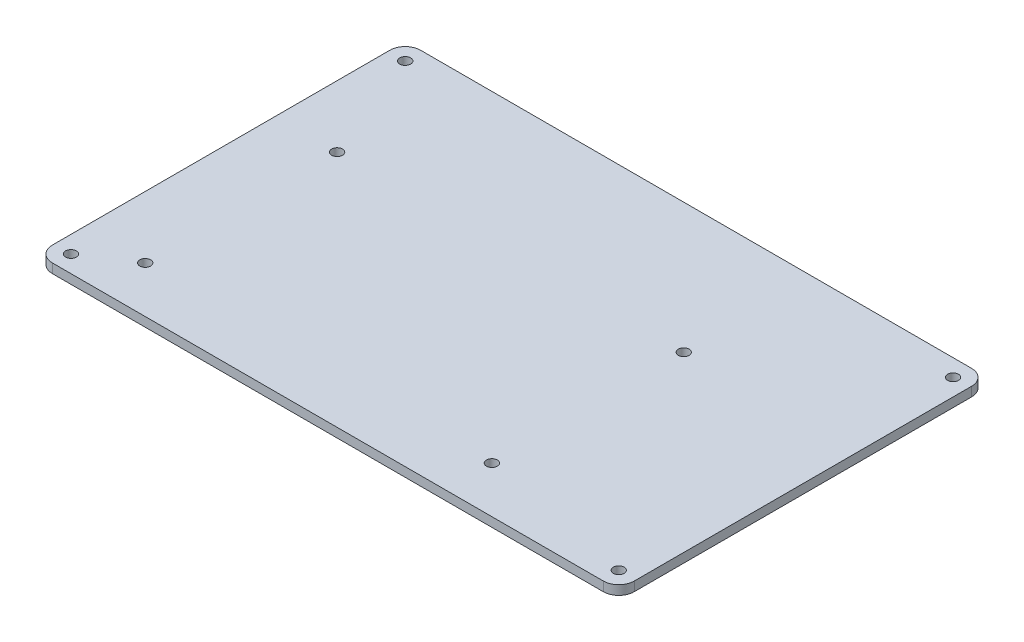
ISO-10303-21;
HEADER;
FILE_DESCRIPTION(('STEP AP214'),'2;1');
FILE_NAME('part.step','',(''),(''),'','','');
FILE_SCHEMA(('AUTOMOTIVE_DESIGN { 1 0 10303 214 1 1 1 1 }'));
ENDSEC;
DATA;
#1=APPLICATION_CONTEXT('core data for automotive mechanical design processes');
#2=APPLICATION_PROTOCOL_DEFINITION('international standard','automotive_design',2000,#1);
#3=PRODUCT_CONTEXT('',#1,'mechanical');
#4=PRODUCT('Part','Part','',(#3));
#5=PRODUCT_RELATED_PRODUCT_CATEGORY('part','',(#4));
#6=PRODUCT_DEFINITION_FORMATION('','',#4);
#7=PRODUCT_DEFINITION_CONTEXT('part definition',#1,'design');
#8=PRODUCT_DEFINITION('design','',#6,#7);
#9=PRODUCT_DEFINITION_SHAPE('','',#8);
#10=(LENGTH_UNIT() NAMED_UNIT(*) SI_UNIT(.MILLI.,.METRE.));
#11=(NAMED_UNIT(*) PLANE_ANGLE_UNIT() SI_UNIT($,.RADIAN.));
#12=(NAMED_UNIT(*) SI_UNIT($,.STERADIAN.) SOLID_ANGLE_UNIT());
#13=UNCERTAINTY_MEASURE_WITH_UNIT(LENGTH_MEASURE(1.E-05),#10,'distance_accuracy_value','');
#14=(GEOMETRIC_REPRESENTATION_CONTEXT(3) GLOBAL_UNCERTAINTY_ASSIGNED_CONTEXT((#13)) GLOBAL_UNIT_ASSIGNED_CONTEXT((#10,
#11,#12)) REPRESENTATION_CONTEXT('',''));
#15=CARTESIAN_POINT('',(0.,0.,0.));
#16=DIRECTION('',(0.,0.,1.));
#17=DIRECTION('',(1.,0.,0.));
#18=AXIS2_PLACEMENT_3D('',#15,#16,#17);
#19=CARTESIAN_POINT('',(-8.59109213570956,3.,30.3281794014014));
#20=DIRECTION('',(0.,-1.,0.));
#21=DIRECTION('',(0.,0.,-1.));
#22=AXIS2_PLACEMENT_3D('',#19,#20,#21);
#23=CYLINDRICAL_SURFACE('',#22,5.);
#24=CARTESIAN_POINT('',(-8.59109213570956,0.,30.3281794014014));
#25=DIRECTION('',(0.,1.,0.));
#26=DIRECTION('',(0.,0.,1.));
#27=AXIS2_PLACEMENT_3D('',#24,#25,#26);
#28=CIRCLE('',#27,5.);
#29=CARTESIAN_POINT('',(-8.59109213570956,0.,25.3281794014014));
#30=VERTEX_POINT('',#29);
#31=CARTESIAN_POINT('',(-13.5910921357096,0.,30.3281794014014));
#32=VERTEX_POINT('',#31);
#33=EDGE_CURVE('E587',#30,#32,#28,.T.);
#34=ORIENTED_EDGE('',*,*,#33,.T.);
#35=DIRECTION('',(0.,-1.,0.));
#36=VECTOR('',#35,1.);
#37=CARTESIAN_POINT('',(-13.5910921357096,3.,30.3281794014014));
#38=LINE('',#37,#36);
#39=CARTESIAN_POINT('',(-13.5910921357096,3.,30.3281794014014));
#40=VERTEX_POINT('',#39);
#41=EDGE_CURVE('E258',#40,#32,#38,.T.);
#42=ORIENTED_EDGE('',*,*,#41,.F.);
#43=CARTESIAN_POINT('',(-8.59109213570956,3.,30.3281794014014));
#44=DIRECTION('',(0.,1.,0.));
#45=DIRECTION('',(0.,0.,1.));
#46=AXIS2_PLACEMENT_3D('',#43,#44,#45);
#47=CIRCLE('',#46,5.);
#48=CARTESIAN_POINT('',(-8.59109213570956,3.,25.3281794014014));
#49=VERTEX_POINT('',#48);
#50=EDGE_CURVE('E558',#49,#40,#47,.T.);
#51=ORIENTED_EDGE('',*,*,#50,.F.);
#52=DIRECTION('',(0.,-1.,0.));
#53=VECTOR('',#52,1.);
#54=CARTESIAN_POINT('',(-8.59109213570956,3.,25.3281794014014));
#55=LINE('',#54,#53);
#56=EDGE_CURVE('E12',#49,#30,#55,.T.);
#57=ORIENTED_EDGE('',*,*,#56,.T.);
#58=EDGE_LOOP('',(#34,#42,#51,#57));
#59=FACE_BOUND('',#58,.T.);
#60=ADVANCED_FACE('F250',(#59),#23,.T.);
#61=CARTESIAN_POINT('',(-13.5910921357096,3.,0.));
#62=DIRECTION('',(1.,0.,0.));
#63=DIRECTION('',(0.,0.,-1.));
#64=AXIS2_PLACEMENT_3D('',#61,#62,#63);
#65=PLANE('',#64);
#66=DIRECTION('',(0.,0.,1.));
#67=VECTOR('',#66,1.);
#68=CARTESIAN_POINT('',(-13.5910921357096,0.,0.));
#69=LINE('',#68,#67);
#70=CARTESIAN_POINT('',(-13.5910921357096,0.,139.328179401401));
#71=VERTEX_POINT('',#70);
#72=EDGE_CURVE('E589',#32,#71,#69,.T.);
#73=ORIENTED_EDGE('',*,*,#72,.T.);
#74=DIRECTION('',(0.,-1.,0.));
#75=VECTOR('',#74,1.);
#76=CARTESIAN_POINT('',(-13.5910921357096,3.,139.328179401401));
#77=LINE('',#76,#75);
#78=CARTESIAN_POINT('',(-13.5910921357096,3.,139.328179401401));
#79=VERTEX_POINT('',#78);
#80=EDGE_CURVE('E614',#79,#71,#77,.T.);
#81=ORIENTED_EDGE('',*,*,#80,.F.);
#82=DIRECTION('',(0.,0.,1.));
#83=VECTOR('',#82,1.);
#84=CARTESIAN_POINT('',(-13.5910921357096,3.,0.));
#85=LINE('',#84,#83);
#86=EDGE_CURVE('E560',#40,#79,#85,.T.);
#87=ORIENTED_EDGE('',*,*,#86,.F.);
#88=ORIENTED_EDGE('',*,*,#41,.T.);
#89=EDGE_LOOP('',(#73,#81,#87,#88));
#90=FACE_BOUND('',#89,.T.);
#91=ADVANCED_FACE('F621',(#90),#65,.F.);
#92=CARTESIAN_POINT('',(-8.59109213570959,3.,139.328179401401));
#93=DIRECTION('',(0.,-1.,0.));
#94=DIRECTION('',(0.,0.,-1.));
#95=AXIS2_PLACEMENT_3D('',#92,#93,#94);
#96=CYLINDRICAL_SURFACE('',#95,5.);
#97=CARTESIAN_POINT('',(-8.59109213570959,0.,139.328179401401));
#98=DIRECTION('',(0.,1.,0.));
#99=DIRECTION('',(0.,0.,1.));
#100=AXIS2_PLACEMENT_3D('',#97,#98,#99);
#101=CIRCLE('',#100,5.);
#102=CARTESIAN_POINT('',(-8.59109213570959,0.,144.328179401401));
#103=VERTEX_POINT('',#102);
#104=EDGE_CURVE('E591',#71,#103,#101,.T.);
#105=ORIENTED_EDGE('',*,*,#104,.T.);
#106=DIRECTION('',(0.,-1.,0.));
#107=VECTOR('',#106,1.);
#108=CARTESIAN_POINT('',(-8.59109213570959,3.,144.328179401401));
#109=LINE('',#108,#107);
#110=CARTESIAN_POINT('',(-8.59109213570959,3.,144.328179401401));
#111=VERTEX_POINT('',#110);
#112=EDGE_CURVE('E611',#111,#103,#109,.T.);
#113=ORIENTED_EDGE('',*,*,#112,.F.);
#114=CARTESIAN_POINT('',(-8.59109213570959,3.,139.328179401401));
#115=DIRECTION('',(0.,1.,0.));
#116=DIRECTION('',(0.,0.,1.));
#117=AXIS2_PLACEMENT_3D('',#114,#115,#116);
#118=CIRCLE('',#117,5.);
#119=EDGE_CURVE('E562',#79,#111,#118,.T.);
#120=ORIENTED_EDGE('',*,*,#119,.F.);
#121=ORIENTED_EDGE('',*,*,#80,.T.);
#122=EDGE_LOOP('',(#105,#113,#120,#121));
#123=FACE_BOUND('',#122,.T.);
#124=ADVANCED_FACE('F633',(#123),#96,.T.);
#125=CARTESIAN_POINT('',(0.,3.,144.328179401401));
#126=DIRECTION('',(0.,0.,-1.));
#127=DIRECTION('',(-1.,0.,0.));
#128=AXIS2_PLACEMENT_3D('',#125,#126,#127);
#129=PLANE('',#128);
#130=DIRECTION('',(1.,0.,0.));
#131=VECTOR('',#130,1.);
#132=CARTESIAN_POINT('',(0.,0.,144.328179401401));
#133=LINE('',#132,#131);
#134=CARTESIAN_POINT('',(169.40890786429,0.,144.328179401401));
#135=VERTEX_POINT('',#134);
#136=EDGE_CURVE('E593',#103,#135,#133,.T.);
#137=ORIENTED_EDGE('',*,*,#136,.T.);
#138=DIRECTION('',(0.,-1.,0.));
#139=VECTOR('',#138,1.);
#140=CARTESIAN_POINT('',(169.40890786429,3.,144.328179401401));
#141=LINE('',#140,#139);
#142=CARTESIAN_POINT('',(169.40890786429,3.,144.328179401401));
#143=VERTEX_POINT('',#142);
#144=EDGE_CURVE('E608',#143,#135,#141,.T.);
#145=ORIENTED_EDGE('',*,*,#144,.F.);
#146=DIRECTION('',(1.,0.,0.));
#147=VECTOR('',#146,1.);
#148=CARTESIAN_POINT('',(0.,3.,144.328179401401));
#149=LINE('',#148,#147);
#150=EDGE_CURVE('E564',#111,#143,#149,.T.);
#151=ORIENTED_EDGE('',*,*,#150,.F.);
#152=ORIENTED_EDGE('',*,*,#112,.T.);
#153=EDGE_LOOP('',(#137,#145,#151,#152));
#154=FACE_BOUND('',#153,.T.);
#155=ADVANCED_FACE('F637',(#154),#129,.F.);
#156=CARTESIAN_POINT('',(169.40890786429,3.,139.328179401401));
#157=DIRECTION('',(0.,-1.,0.));
#158=DIRECTION('',(0.,0.,-1.));
#159=AXIS2_PLACEMENT_3D('',#156,#157,#158);
#160=CYLINDRICAL_SURFACE('',#159,5.);
#161=CARTESIAN_POINT('',(169.40890786429,0.,139.328179401401));
#162=DIRECTION('',(0.,1.,0.));
#163=DIRECTION('',(0.,0.,1.));
#164=AXIS2_PLACEMENT_3D('',#161,#162,#163);
#165=CIRCLE('',#164,5.);
#166=CARTESIAN_POINT('',(174.40890786429,0.,139.328179401401));
#167=VERTEX_POINT('',#166);
#168=EDGE_CURVE('E595',#135,#167,#165,.T.);
#169=ORIENTED_EDGE('',*,*,#168,.T.);
#170=DIRECTION('',(0.,-1.,0.));
#171=VECTOR('',#170,1.);
#172=CARTESIAN_POINT('',(174.40890786429,3.,139.328179401401));
#173=LINE('',#172,#171);
#174=CARTESIAN_POINT('',(174.40890786429,3.,139.328179401401));
#175=VERTEX_POINT('',#174);
#176=EDGE_CURVE('E605',#175,#167,#173,.T.);
#177=ORIENTED_EDGE('',*,*,#176,.F.);
#178=CARTESIAN_POINT('',(169.40890786429,3.,139.328179401401));
#179=DIRECTION('',(0.,1.,0.));
#180=DIRECTION('',(0.,0.,1.));
#181=AXIS2_PLACEMENT_3D('',#178,#179,#180);
#182=CIRCLE('',#181,5.);
#183=EDGE_CURVE('E566',#143,#175,#182,.T.);
#184=ORIENTED_EDGE('',*,*,#183,.F.);
#185=ORIENTED_EDGE('',*,*,#144,.T.);
#186=EDGE_LOOP('',(#169,#177,#184,#185));
#187=FACE_BOUND('',#186,.T.);
#188=ADVANCED_FACE('F658',(#187),#160,.T.);
#189=CARTESIAN_POINT('',(174.40890786429,3.,0.));
#190=DIRECTION('',(-1.,0.,0.));
#191=DIRECTION('',(0.,0.,1.));
#192=AXIS2_PLACEMENT_3D('',#189,#190,#191);
#193=PLANE('',#192);
#194=DIRECTION('',(0.,0.,-1.));
#195=VECTOR('',#194,1.);
#196=CARTESIAN_POINT('',(174.40890786429,0.,0.));
#197=LINE('',#196,#195);
#198=CARTESIAN_POINT('',(174.40890786429,0.,30.3281794014014));
#199=VERTEX_POINT('',#198);
#200=EDGE_CURVE('E597',#167,#199,#197,.T.);
#201=ORIENTED_EDGE('',*,*,#200,.T.);
#202=DIRECTION('',(0.,-1.,0.));
#203=VECTOR('',#202,1.);
#204=CARTESIAN_POINT('',(174.40890786429,3.,30.3281794014014));
#205=LINE('',#204,#203);
#206=CARTESIAN_POINT('',(174.40890786429,3.,30.3281794014014));
#207=VERTEX_POINT('',#206);
#208=EDGE_CURVE('E602',#207,#199,#205,.T.);
#209=ORIENTED_EDGE('',*,*,#208,.F.);
#210=DIRECTION('',(0.,0.,-1.));
#211=VECTOR('',#210,1.);
#212=CARTESIAN_POINT('',(174.40890786429,3.,0.));
#213=LINE('',#212,#211);
#214=EDGE_CURVE('E568',#175,#207,#213,.T.);
#215=ORIENTED_EDGE('',*,*,#214,.F.);
#216=ORIENTED_EDGE('',*,*,#176,.T.);
#217=EDGE_LOOP('',(#201,#209,#215,#216));
#218=FACE_BOUND('',#217,.T.);
#219=ADVANCED_FACE('F656',(#218),#193,.F.);
#220=CARTESIAN_POINT('',(169.40890786429,3.,30.3281794014014));
#221=DIRECTION('',(0.,-1.,0.));
#222=DIRECTION('',(0.,0.,-1.));
#223=AXIS2_PLACEMENT_3D('',#220,#221,#222);
#224=CYLINDRICAL_SURFACE('',#223,5.);
#225=CARTESIAN_POINT('',(169.40890786429,0.,30.3281794014014));
#226=DIRECTION('',(0.,1.,0.));
#227=DIRECTION('',(0.,0.,1.));
#228=AXIS2_PLACEMENT_3D('',#225,#226,#227);
#229=CIRCLE('',#228,5.);
#230=CARTESIAN_POINT('',(169.40890786429,0.,25.3281794014014));
#231=VERTEX_POINT('',#230);
#232=EDGE_CURVE('E546',#199,#231,#229,.T.);
#233=ORIENTED_EDGE('',*,*,#232,.T.);
#234=DIRECTION('',(0.,-1.,0.));
#235=VECTOR('',#234,1.);
#236=CARTESIAN_POINT('',(169.40890786429,3.,25.3281794014014));
#237=LINE('',#236,#235);
#238=CARTESIAN_POINT('',(169.40890786429,3.,25.3281794014014));
#239=VERTEX_POINT('',#238);
#240=EDGE_CURVE('E572',#239,#231,#237,.T.);
#241=ORIENTED_EDGE('',*,*,#240,.F.);
#242=CARTESIAN_POINT('',(169.40890786429,3.,30.3281794014014));
#243=DIRECTION('',(0.,1.,0.));
#244=DIRECTION('',(0.,0.,1.));
#245=AXIS2_PLACEMENT_3D('',#242,#243,#244);
#246=CIRCLE('',#245,5.);
#247=EDGE_CURVE('E570',#207,#239,#246,.T.);
#248=ORIENTED_EDGE('',*,*,#247,.F.);
#249=ORIENTED_EDGE('',*,*,#208,.T.);
#250=EDGE_LOOP('',(#233,#241,#248,#249));
#251=FACE_BOUND('',#250,.T.);
#252=ADVANCED_FACE('F651',(#251),#224,.T.);
#253=CARTESIAN_POINT('',(0.,3.,25.3281794014014));
#254=DIRECTION('',(0.,0.,1.));
#255=DIRECTION('',(1.,0.,0.));
#256=AXIS2_PLACEMENT_3D('',#253,#254,#255);
#257=PLANE('',#256);
#258=DIRECTION('',(-1.,0.,0.));
#259=VECTOR('',#258,1.);
#260=CARTESIAN_POINT('',(0.,0.,25.3281794014014));
#261=LINE('',#260,#259);
#262=EDGE_CURVE('E584',#231,#30,#261,.T.);
#263=ORIENTED_EDGE('',*,*,#262,.T.);
#264=ORIENTED_EDGE('',*,*,#56,.F.);
#265=DIRECTION('',(-1.,0.,0.));
#266=VECTOR('',#265,1.);
#267=CARTESIAN_POINT('',(0.,3.,25.3281794014014));
#268=LINE('',#267,#266);
#269=EDGE_CURVE('E555',#239,#49,#268,.T.);
#270=ORIENTED_EDGE('',*,*,#269,.F.);
#271=ORIENTED_EDGE('',*,*,#240,.T.);
#272=EDGE_LOOP('',(#263,#264,#270,#271));
#273=FACE_BOUND('',#272,.T.);
#274=ADVANCED_FACE('F646',(#273),#257,.F.);
#275=CARTESIAN_POINT('',(168.90890786429,3.,30.8281794014014));
#276=DIRECTION('',(0.,-1.,0.));
#277=DIRECTION('',(0.,0.,-1.));
#278=AXIS2_PLACEMENT_3D('',#275,#276,#277);
#279=CYLINDRICAL_SURFACE('',#278,1.75000000000001);
#280=CARTESIAN_POINT('',(168.90890786429,3.,30.8281794014014));
#281=DIRECTION('',(0.,1.,0.));
#282=DIRECTION('',(0.,0.,1.));
#283=AXIS2_PLACEMENT_3D('',#280,#281,#282);
#284=CIRCLE('',#283,1.75000000000001);
#285=CARTESIAN_POINT('',(168.90890786429,3.,32.5781794014014));
#286=VERTEX_POINT('',#285);
#287=EDGE_CURVE('E552',#286,#286,#284,.T.);
#288=ORIENTED_EDGE('',*,*,#287,.T.);
#289=EDGE_LOOP('',(#288));
#290=FACE_BOUND('',#289,.T.);
#291=CARTESIAN_POINT('',(168.90890786429,0.,30.8281794014014));
#292=DIRECTION('',(0.,1.,0.));
#293=DIRECTION('',(0.,0.,1.));
#294=AXIS2_PLACEMENT_3D('',#291,#292,#293);
#295=CIRCLE('',#294,1.75000000000001);
#296=CARTESIAN_POINT('',(168.90890786429,0.,32.5781794014014));
#297=VERTEX_POINT('',#296);
#298=EDGE_CURVE('E581',#297,#297,#295,.T.);
#299=ORIENTED_EDGE('',*,*,#298,.F.);
#300=EDGE_LOOP('',(#299));
#301=FACE_BOUND('',#300,.T.);
#302=ADVANCED_FACE('F677',(#290,#301),#279,.F.);
#303=CARTESIAN_POINT('',(-8.09109213570955,3.,30.8281794014014));
#304=DIRECTION('',(0.,-1.,0.));
#305=DIRECTION('',(0.,0.,-1.));
#306=AXIS2_PLACEMENT_3D('',#303,#304,#305);
#307=CYLINDRICAL_SURFACE('',#306,1.75);
#308=CARTESIAN_POINT('',(-8.09109213570955,3.,30.8281794014014));
#309=DIRECTION('',(0.,1.,0.));
#310=DIRECTION('',(0.,0.,1.));
#311=AXIS2_PLACEMENT_3D('',#308,#309,#310);
#312=CIRCLE('',#311,1.75);
#313=CARTESIAN_POINT('',(-8.09109213570955,3.,32.5781794014014));
#314=VERTEX_POINT('',#313);
#315=EDGE_CURVE('E549',#314,#314,#312,.T.);
#316=ORIENTED_EDGE('',*,*,#315,.T.);
#317=EDGE_LOOP('',(#316));
#318=FACE_BOUND('',#317,.T.);
#319=CARTESIAN_POINT('',(-8.09109213570955,0.,30.8281794014014));
#320=DIRECTION('',(0.,1.,0.));
#321=DIRECTION('',(0.,0.,1.));
#322=AXIS2_PLACEMENT_3D('',#319,#320,#321);
#323=CIRCLE('',#322,1.75);
#324=CARTESIAN_POINT('',(-8.09109213570955,0.,32.5781794014014));
#325=VERTEX_POINT('',#324);
#326=EDGE_CURVE('E578',#325,#325,#323,.T.);
#327=ORIENTED_EDGE('',*,*,#326,.F.);
#328=EDGE_LOOP('',(#327));
#329=FACE_BOUND('',#328,.T.);
#330=ADVANCED_FACE('F680',(#318,#329),#307,.F.);
#331=CARTESIAN_POINT('',(-8.09109213570955,3.,138.828179401401));
#332=DIRECTION('',(0.,-1.,0.));
#333=DIRECTION('',(0.,0.,-1.));
#334=AXIS2_PLACEMENT_3D('',#331,#332,#333);
#335=CYLINDRICAL_SURFACE('',#334,1.75);
#336=CARTESIAN_POINT('',(-8.09109213570955,3.,138.828179401401));
#337=DIRECTION('',(0.,1.,0.));
#338=DIRECTION('',(0.,0.,1.));
#339=AXIS2_PLACEMENT_3D('',#336,#337,#338);
#340=CIRCLE('',#339,1.75);
#341=CARTESIAN_POINT('',(-8.09109213570955,3.,140.578179401401));
#342=VERTEX_POINT('',#341);
#343=EDGE_CURVE('E545',#342,#342,#340,.T.);
#344=ORIENTED_EDGE('',*,*,#343,.T.);
#345=EDGE_LOOP('',(#344));
#346=FACE_BOUND('',#345,.T.);
#347=CARTESIAN_POINT('',(-8.09109213570955,0.,138.828179401401));
#348=DIRECTION('',(0.,1.,0.));
#349=DIRECTION('',(0.,0.,1.));
#350=AXIS2_PLACEMENT_3D('',#347,#348,#349);
#351=CIRCLE('',#350,1.75);
#352=CARTESIAN_POINT('',(-8.09109213570955,0.,140.578179401401));
#353=VERTEX_POINT('',#352);
#354=EDGE_CURVE('E575',#353,#353,#351,.T.);
#355=ORIENTED_EDGE('',*,*,#354,.F.);
#356=EDGE_LOOP('',(#355));
#357=FACE_BOUND('',#356,.T.);
#358=ADVANCED_FACE('F683',(#346,#357),#335,.F.);
#359=CARTESIAN_POINT('',(168.90890786429,3.,138.828179401401));
#360=DIRECTION('',(0.,-1.,0.));
#361=DIRECTION('',(0.,0.,-1.));
#362=AXIS2_PLACEMENT_3D('',#359,#360,#361);
#363=CYLINDRICAL_SURFACE('',#362,1.75000000000001);
#364=CARTESIAN_POINT('',(168.90890786429,3.,138.828179401401));
#365=DIRECTION('',(0.,1.,0.));
#366=DIRECTION('',(0.,0.,1.));
#367=AXIS2_PLACEMENT_3D('',#364,#365,#366);
#368=CIRCLE('',#367,1.75000000000001);
#369=CARTESIAN_POINT('',(168.90890786429,3.,140.578179401401));
#370=VERTEX_POINT('',#369);
#371=EDGE_CURVE('E542',#370,#370,#368,.T.);
#372=ORIENTED_EDGE('',*,*,#371,.T.);
#373=EDGE_LOOP('',(#372));
#374=FACE_BOUND('',#373,.T.);
#375=CARTESIAN_POINT('',(168.90890786429,0.,138.828179401401));
#376=DIRECTION('',(0.,1.,0.));
#377=DIRECTION('',(0.,0.,1.));
#378=AXIS2_PLACEMENT_3D('',#375,#376,#377);
#379=CIRCLE('',#378,1.75000000000001);
#380=CARTESIAN_POINT('',(168.90890786429,0.,140.578179401401));
#381=VERTEX_POINT('',#380);
#382=EDGE_CURVE('E528',#381,#381,#379,.T.);
#383=ORIENTED_EDGE('',*,*,#382,.F.);
#384=EDGE_LOOP('',(#383));
#385=FACE_BOUND('',#384,.T.);
#386=ADVANCED_FACE('F252',(#374,#385),#363,.F.);
#387=CARTESIAN_POINT('',(0.,0.,0.));
#388=DIRECTION('',(0.,1.,0.));
#389=DIRECTION('',(0.,0.,1.));
#390=AXIS2_PLACEMENT_3D('',#387,#388,#389);
#391=PLANE('',#390);
#392=ORIENTED_EDGE('',*,*,#382,.T.);
#393=EDGE_LOOP('',(#392));
#394=FACE_BOUND('',#393,.T.);
#395=ORIENTED_EDGE('',*,*,#354,.T.);
#396=EDGE_LOOP('',(#395));
#397=FACE_BOUND('',#396,.T.);
#398=ORIENTED_EDGE('',*,*,#326,.T.);
#399=EDGE_LOOP('',(#398));
#400=FACE_BOUND('',#399,.T.);
#401=ORIENTED_EDGE('',*,*,#298,.T.);
#402=EDGE_LOOP('',(#401));
#403=FACE_BOUND('',#402,.T.);
#404=ORIENTED_EDGE('',*,*,#262,.F.);
#405=ORIENTED_EDGE('',*,*,#232,.F.);
#406=ORIENTED_EDGE('',*,*,#200,.F.);
#407=ORIENTED_EDGE('',*,*,#168,.F.);
#408=ORIENTED_EDGE('',*,*,#136,.F.);
#409=ORIENTED_EDGE('',*,*,#104,.F.);
#410=ORIENTED_EDGE('',*,*,#72,.F.);
#411=ORIENTED_EDGE('',*,*,#33,.F.);
#412=EDGE_LOOP('',(#404,#405,#406,#407,#408,#409,#410,#411));
#413=FACE_BOUND('',#412,.T.);
#414=DIRECTION('',(-1.,0.,0.));
#415=VECTOR('',#414,1.);
#416=CARTESIAN_POINT('',(0.,0.,28.8281794014014));
#417=LINE('',#416,#415);
#418=CARTESIAN_POINT('',(165.444806249153,0.,28.8281794014014));
#419=VERTEX_POINT('',#418);
#420=CARTESIAN_POINT('',(-4.62699052057178,0.,28.8281794014014));
#421=VERTEX_POINT('',#420);
#422=EDGE_CURVE('E452',#419,#421,#417,.T.);
#423=ORIENTED_EDGE('',*,*,#422,.T.);
#424=CARTESIAN_POINT('',(-8.09109213570955,0.,30.8281794014014));
#425=DIRECTION('',(0.,1.,0.));
#426=DIRECTION('',(1.,0.,0.));
#427=AXIS2_PLACEMENT_3D('',#424,#425,#426);
#428=CIRCLE('',#427,4.00000000000001);
#429=CARTESIAN_POINT('',(-10.0910921357095,0.,34.2922810165392));
#430=VERTEX_POINT('',#429);
#431=EDGE_CURVE('E454',#430,#421,#428,.T.);
#432=ORIENTED_EDGE('',*,*,#431,.F.);
#433=DIRECTION('',(0.,0.,-1.));
#434=VECTOR('',#433,1.);
#435=CARTESIAN_POINT('',(-10.0910921357095,0.,0.));
#436=LINE('',#435,#434);
#437=CARTESIAN_POINT('',(-10.0910921357095,0.,135.364077786264));
#438=VERTEX_POINT('',#437);
#439=EDGE_CURVE('E458',#438,#430,#436,.T.);
#440=ORIENTED_EDGE('',*,*,#439,.F.);
#441=CARTESIAN_POINT('',(-8.09109213570955,0.,138.828179401401));
#442=DIRECTION('',(0.,1.,0.));
#443=DIRECTION('',(1.,0.,0.));
#444=AXIS2_PLACEMENT_3D('',#441,#442,#443);
#445=CIRCLE('',#444,4.);
#446=CARTESIAN_POINT('',(-4.62699052057179,0.,140.828179401401));
#447=VERTEX_POINT('',#446);
#448=EDGE_CURVE('E420',#447,#438,#445,.T.);
#449=ORIENTED_EDGE('',*,*,#448,.F.);
#450=DIRECTION('',(-1.,0.,0.));
#451=VECTOR('',#450,1.);
#452=CARTESIAN_POINT('',(0.,0.,140.828179401401));
#453=LINE('',#452,#451);
#454=CARTESIAN_POINT('',(165.444806249153,0.,140.828179401401));
#455=VERTEX_POINT('',#454);
#456=EDGE_CURVE('E461',#455,#447,#453,.T.);
#457=ORIENTED_EDGE('',*,*,#456,.F.);
#458=CARTESIAN_POINT('',(168.90890786429,0.,138.828179401401));
#459=DIRECTION('',(0.,1.,0.));
#460=DIRECTION('',(1.,0.,0.));
#461=AXIS2_PLACEMENT_3D('',#458,#459,#460);
#462=CIRCLE('',#461,3.99999999999999);
#463=CARTESIAN_POINT('',(170.90890786429,0.,135.364077786264));
#464=VERTEX_POINT('',#463);
#465=EDGE_CURVE('E464',#464,#455,#462,.T.);
#466=ORIENTED_EDGE('',*,*,#465,.F.);
#467=DIRECTION('',(0.,0.,-1.));
#468=VECTOR('',#467,1.);
#469=CARTESIAN_POINT('',(170.90890786429,0.,0.));
#470=LINE('',#469,#468);
#471=CARTESIAN_POINT('',(170.90890786429,0.,34.2922810165392));
#472=VERTEX_POINT('',#471);
#473=EDGE_CURVE('E467',#464,#472,#470,.T.);
#474=ORIENTED_EDGE('',*,*,#473,.T.);
#475=CARTESIAN_POINT('',(168.90890786429,0.,30.8281794014014));
#476=DIRECTION('',(0.,1.,0.));
#477=DIRECTION('',(1.,0.,0.));
#478=AXIS2_PLACEMENT_3D('',#475,#476,#477);
#479=CIRCLE('',#478,3.99999999999999);
#480=EDGE_CURVE('E470',#419,#472,#479,.T.);
#481=ORIENTED_EDGE('',*,*,#480,.F.);
#482=EDGE_LOOP('',(#423,#432,#440,#449,#457,#466,#474,#481));
#483=FACE_BOUND('',#482,.T.);
#484=ADVANCED_FACE('F627',(#394,#397,#400,#403,#413,#483),#391,.F.);
#485=CARTESIAN_POINT('',(0.,3.,0.));
#486=DIRECTION('',(0.,1.,0.));
#487=DIRECTION('',(0.,0.,1.));
#488=AXIS2_PLACEMENT_3D('',#485,#486,#487);
#489=PLANE('',#488);
#490=CARTESIAN_POINT('',(118.40890786429,3.,129.328179401401));
#491=DIRECTION('',(0.,1.,0.));
#492=DIRECTION('',(0.,0.,1.));
#493=AXIS2_PLACEMENT_3D('',#490,#491,#492);
#494=CIRCLE('',#493,1.75000000000001);
#495=CARTESIAN_POINT('',(118.40890786429,3.,131.078179401401));
#496=VERTEX_POINT('',#495);
#497=EDGE_CURVE('E455',#496,#496,#494,.T.);
#498=ORIENTED_EDGE('',*,*,#497,.F.);
#499=EDGE_LOOP('',(#498));
#500=FACE_BOUND('',#499,.T.);
#501=CARTESIAN_POINT('',(6.40890786429045,3.,129.328179401401));
#502=DIRECTION('',(0.,1.,0.));
#503=DIRECTION('',(0.,0.,1.));
#504=AXIS2_PLACEMENT_3D('',#501,#502,#503);
#505=CIRCLE('',#504,1.75);
#506=CARTESIAN_POINT('',(6.40890786429045,3.,131.078179401401));
#507=VERTEX_POINT('',#506);
#508=EDGE_CURVE('E1079',#507,#507,#505,.T.);
#509=ORIENTED_EDGE('',*,*,#508,.F.);
#510=EDGE_LOOP('',(#509));
#511=FACE_BOUND('',#510,.T.);
#512=CARTESIAN_POINT('',(6.40890786429045,3.,67.3281794014014));
#513=DIRECTION('',(0.,1.,0.));
#514=DIRECTION('',(0.,0.,1.));
#515=AXIS2_PLACEMENT_3D('',#512,#513,#514);
#516=CIRCLE('',#515,1.75);
#517=CARTESIAN_POINT('',(6.40890786429045,3.,69.0781794014014));
#518=VERTEX_POINT('',#517);
#519=EDGE_CURVE('E1076',#518,#518,#516,.T.);
#520=ORIENTED_EDGE('',*,*,#519,.F.);
#521=EDGE_LOOP('',(#520));
#522=FACE_BOUND('',#521,.T.);
#523=CARTESIAN_POINT('',(118.40890786429,3.,67.3281794014015));
#524=DIRECTION('',(0.,1.,0.));
#525=DIRECTION('',(0.,0.,1.));
#526=AXIS2_PLACEMENT_3D('',#523,#524,#525);
#527=CIRCLE('',#526,1.75000000000001);
#528=CARTESIAN_POINT('',(118.40890786429,3.,69.0781794014015));
#529=VERTEX_POINT('',#528);
#530=EDGE_CURVE('E1073',#529,#529,#527,.T.);
#531=ORIENTED_EDGE('',*,*,#530,.F.);
#532=EDGE_LOOP('',(#531));
#533=FACE_BOUND('',#532,.T.);
#534=ORIENTED_EDGE('',*,*,#371,.F.);
#535=EDGE_LOOP('',(#534));
#536=FACE_BOUND('',#535,.T.);
#537=ORIENTED_EDGE('',*,*,#343,.F.);
#538=EDGE_LOOP('',(#537));
#539=FACE_BOUND('',#538,.T.);
#540=ORIENTED_EDGE('',*,*,#315,.F.);
#541=EDGE_LOOP('',(#540));
#542=FACE_BOUND('',#541,.T.);
#543=ORIENTED_EDGE('',*,*,#287,.F.);
#544=EDGE_LOOP('',(#543));
#545=FACE_BOUND('',#544,.T.);
#546=ORIENTED_EDGE('',*,*,#269,.T.);
#547=ORIENTED_EDGE('',*,*,#50,.T.);
#548=ORIENTED_EDGE('',*,*,#86,.T.);
#549=ORIENTED_EDGE('',*,*,#119,.T.);
#550=ORIENTED_EDGE('',*,*,#150,.T.);
#551=ORIENTED_EDGE('',*,*,#183,.T.);
#552=ORIENTED_EDGE('',*,*,#214,.T.);
#553=ORIENTED_EDGE('',*,*,#247,.T.);
#554=EDGE_LOOP('',(#546,#547,#548,#549,#550,#551,#552,#553));
#555=FACE_BOUND('',#554,.T.);
#556=ADVANCED_FACE('F641',(#500,#511,#522,#533,#536,#539,#542,#545,#555),#489,.T.);
#557=CARTESIAN_POINT('',(0.,-3.,28.8281794014014));
#558=DIRECTION('',(0.,0.,-1.));
#559=DIRECTION('',(-1.,0.,0.));
#560=AXIS2_PLACEMENT_3D('',#557,#558,#559);
#561=PLANE('',#560);
#562=ORIENTED_EDGE('',*,*,#422,.F.);
#563=DIRECTION('',(0.,1.,0.));
#564=VECTOR('',#563,1.);
#565=CARTESIAN_POINT('',(165.444806249153,-3.,28.8281794014014));
#566=LINE('',#565,#564);
#567=CARTESIAN_POINT('',(165.444806249153,-3.,28.8281794014014));
#568=VERTEX_POINT('',#567);
#569=EDGE_CURVE('E473',#568,#419,#566,.T.);
#570=ORIENTED_EDGE('',*,*,#569,.F.);
#571=DIRECTION('',(-1.,0.,0.));
#572=VECTOR('',#571,1.);
#573=CARTESIAN_POINT('',(0.,-3.,28.8281794014014));
#574=LINE('',#573,#572);
#575=CARTESIAN_POINT('',(-4.62699052057178,-3.,28.8281794014014));
#576=VERTEX_POINT('',#575);
#577=EDGE_CURVE('E265',#568,#576,#574,.T.);
#578=ORIENTED_EDGE('',*,*,#577,.T.);
#579=DIRECTION('',(0.,1.,0.));
#580=VECTOR('',#579,1.);
#581=CARTESIAN_POINT('',(-4.62699052057178,-3.,28.8281794014014));
#582=LINE('',#581,#580);
#583=EDGE_CURVE('E451',#576,#421,#582,.T.);
#584=ORIENTED_EDGE('',*,*,#583,.T.);
#585=EDGE_LOOP('',(#562,#570,#578,#584));
#586=FACE_BOUND('',#585,.T.);
#587=ADVANCED_FACE('F709',(#586),#561,.T.);
#588=CARTESIAN_POINT('',(168.90890786429,-3.,30.8281794014014));
#589=DIRECTION('',(0.,1.,0.));
#590=DIRECTION('',(0.,0.,1.));
#591=AXIS2_PLACEMENT_3D('',#588,#589,#590);
#592=CYLINDRICAL_SURFACE('',#591,3.99999999999999);
#593=ORIENTED_EDGE('',*,*,#480,.T.);
#594=DIRECTION('',(0.,1.,0.));
#595=VECTOR('',#594,1.);
#596=CARTESIAN_POINT('',(170.90890786429,-3.,34.2922810165392));
#597=LINE('',#596,#595);
#598=CARTESIAN_POINT('',(170.90890786429,-3.,34.2922810165392));
#599=VERTEX_POINT('',#598);
#600=EDGE_CURVE('E476',#599,#472,#597,.T.);
#601=ORIENTED_EDGE('',*,*,#600,.F.);
#602=CARTESIAN_POINT('',(168.90890786429,-3.,30.8281794014014));
#603=DIRECTION('',(0.,1.,0.));
#604=DIRECTION('',(1.,0.,0.));
#605=AXIS2_PLACEMENT_3D('',#602,#603,#604);
#606=CIRCLE('',#605,3.99999999999999);
#607=EDGE_CURVE('E448',#568,#599,#606,.T.);
#608=ORIENTED_EDGE('',*,*,#607,.F.);
#609=ORIENTED_EDGE('',*,*,#569,.T.);
#610=EDGE_LOOP('',(#593,#601,#608,#609));
#611=FACE_BOUND('',#610,.T.);
#612=ADVANCED_FACE('F830',(#611),#592,.F.);
#613=CARTESIAN_POINT('',(170.90890786429,-3.,0.));
#614=DIRECTION('',(1.,0.,0.));
#615=DIRECTION('',(0.,0.,-1.));
#616=AXIS2_PLACEMENT_3D('',#613,#614,#615);
#617=PLANE('',#616);
#618=ORIENTED_EDGE('',*,*,#473,.F.);
#619=DIRECTION('',(0.,1.,0.));
#620=VECTOR('',#619,1.);
#621=CARTESIAN_POINT('',(170.90890786429,-3.,135.364077786264));
#622=LINE('',#621,#620);
#623=CARTESIAN_POINT('',(170.90890786429,-3.,135.364077786264));
#624=VERTEX_POINT('',#623);
#625=EDGE_CURVE('E478',#624,#464,#622,.T.);
#626=ORIENTED_EDGE('',*,*,#625,.F.);
#627=DIRECTION('',(0.,0.,-1.));
#628=VECTOR('',#627,1.);
#629=CARTESIAN_POINT('',(170.90890786429,-3.,0.));
#630=LINE('',#629,#628);
#631=EDGE_CURVE('E445',#624,#599,#630,.T.);
#632=ORIENTED_EDGE('',*,*,#631,.T.);
#633=ORIENTED_EDGE('',*,*,#600,.T.);
#634=EDGE_LOOP('',(#618,#626,#632,#633));
#635=FACE_BOUND('',#634,.T.);
#636=ADVANCED_FACE('F838',(#635),#617,.T.);
#637=CARTESIAN_POINT('',(168.90890786429,-3.,138.828179401401));
#638=DIRECTION('',(0.,1.,0.));
#639=DIRECTION('',(0.,0.,1.));
#640=AXIS2_PLACEMENT_3D('',#637,#638,#639);
#641=CYLINDRICAL_SURFACE('',#640,3.99999999999999);
#642=ORIENTED_EDGE('',*,*,#465,.T.);
#643=DIRECTION('',(0.,1.,0.));
#644=VECTOR('',#643,1.);
#645=CARTESIAN_POINT('',(165.444806249153,-3.,140.828179401401));
#646=LINE('',#645,#644);
#647=CARTESIAN_POINT('',(165.444806249153,-3.,140.828179401401));
#648=VERTEX_POINT('',#647);
#649=EDGE_CURVE('E480',#648,#455,#646,.T.);
#650=ORIENTED_EDGE('',*,*,#649,.F.);
#651=CARTESIAN_POINT('',(168.90890786429,-3.,138.828179401401));
#652=DIRECTION('',(0.,1.,0.));
#653=DIRECTION('',(1.,0.,0.));
#654=AXIS2_PLACEMENT_3D('',#651,#652,#653);
#655=CIRCLE('',#654,3.99999999999999);
#656=EDGE_CURVE('E440',#624,#648,#655,.T.);
#657=ORIENTED_EDGE('',*,*,#656,.F.);
#658=ORIENTED_EDGE('',*,*,#625,.T.);
#659=EDGE_LOOP('',(#642,#650,#657,#658));
#660=FACE_BOUND('',#659,.T.);
#661=ADVANCED_FACE('F848',(#660),#641,.F.);
#662=CARTESIAN_POINT('',(0.,-3.,140.828179401401));
#663=DIRECTION('',(0.,0.,-1.));
#664=DIRECTION('',(-1.,0.,0.));
#665=AXIS2_PLACEMENT_3D('',#662,#663,#664);
#666=PLANE('',#665);
#667=ORIENTED_EDGE('',*,*,#456,.T.);
#668=DIRECTION('',(0.,1.,0.));
#669=VECTOR('',#668,1.);
#670=CARTESIAN_POINT('',(-4.62699052057179,-3.,140.828179401401));
#671=LINE('',#670,#669);
#672=CARTESIAN_POINT('',(-4.62699052057179,-3.,140.828179401401));
#673=VERTEX_POINT('',#672);
#674=EDGE_CURVE('E424',#673,#447,#671,.T.);
#675=ORIENTED_EDGE('',*,*,#674,.F.);
#676=DIRECTION('',(-1.,0.,0.));
#677=VECTOR('',#676,1.);
#678=CARTESIAN_POINT('',(0.,-3.,140.828179401401));
#679=LINE('',#678,#677);
#680=EDGE_CURVE('E438',#648,#673,#679,.T.);
#681=ORIENTED_EDGE('',*,*,#680,.F.);
#682=ORIENTED_EDGE('',*,*,#649,.T.);
#683=EDGE_LOOP('',(#667,#675,#681,#682));
#684=FACE_BOUND('',#683,.T.);
#685=ADVANCED_FACE('F858',(#684),#666,.F.);
#686=CARTESIAN_POINT('',(-8.09109213570955,-3.,138.828179401401));
#687=DIRECTION('',(0.,1.,0.));
#688=DIRECTION('',(0.,0.,1.));
#689=AXIS2_PLACEMENT_3D('',#686,#687,#688);
#690=CYLINDRICAL_SURFACE('',#689,4.);
#691=ORIENTED_EDGE('',*,*,#448,.T.);
#692=DIRECTION('',(0.,1.,0.));
#693=VECTOR('',#692,1.);
#694=CARTESIAN_POINT('',(-10.0910921357095,-3.,135.364077786264));
#695=LINE('',#694,#693);
#696=CARTESIAN_POINT('',(-10.0910921357095,-3.,135.364077786264));
#697=VERTEX_POINT('',#696);
#698=EDGE_CURVE('E413',#697,#438,#695,.T.);
#699=ORIENTED_EDGE('',*,*,#698,.F.);
#700=CARTESIAN_POINT('',(-8.09109213570955,-3.,138.828179401401));
#701=DIRECTION('',(0.,1.,0.));
#702=DIRECTION('',(1.,0.,0.));
#703=AXIS2_PLACEMENT_3D('',#700,#701,#702);
#704=CIRCLE('',#703,4.);
#705=EDGE_CURVE('E417',#673,#697,#704,.T.);
#706=ORIENTED_EDGE('',*,*,#705,.F.);
#707=ORIENTED_EDGE('',*,*,#674,.T.);
#708=EDGE_LOOP('',(#691,#699,#706,#707));
#709=FACE_BOUND('',#708,.T.);
#710=ADVANCED_FACE('F415',(#709),#690,.F.);
#711=CARTESIAN_POINT('',(-10.0910921357095,-3.,0.));
#712=DIRECTION('',(1.,0.,0.));
#713=DIRECTION('',(0.,0.,-1.));
#714=AXIS2_PLACEMENT_3D('',#711,#712,#713);
#715=PLANE('',#714);
#716=ORIENTED_EDGE('',*,*,#439,.T.);
#717=DIRECTION('',(0.,1.,0.));
#718=VECTOR('',#717,1.);
#719=CARTESIAN_POINT('',(-10.0910921357095,-3.,34.2922810165392));
#720=LINE('',#719,#718);
#721=CARTESIAN_POINT('',(-10.0910921357095,-3.,34.2922810165392));
#722=VERTEX_POINT('',#721);
#723=EDGE_CURVE('E425',#722,#430,#720,.T.);
#724=ORIENTED_EDGE('',*,*,#723,.F.);
#725=DIRECTION('',(0.,0.,-1.));
#726=VECTOR('',#725,1.);
#727=CARTESIAN_POINT('',(-10.0910921357095,-3.,0.));
#728=LINE('',#727,#726);
#729=EDGE_CURVE('E428',#697,#722,#728,.T.);
#730=ORIENTED_EDGE('',*,*,#729,.F.);
#731=ORIENTED_EDGE('',*,*,#698,.T.);
#732=EDGE_LOOP('',(#716,#724,#730,#731));
#733=FACE_BOUND('',#732,.T.);
#734=ADVANCED_FACE('F429',(#733),#715,.F.);
#735=CARTESIAN_POINT('',(-8.09109213570955,-3.,30.8281794014014));
#736=DIRECTION('',(0.,1.,0.));
#737=DIRECTION('',(0.,0.,1.));
#738=AXIS2_PLACEMENT_3D('',#735,#736,#737);
#739=CYLINDRICAL_SURFACE('',#738,4.00000000000001);
#740=ORIENTED_EDGE('',*,*,#431,.T.);
#741=ORIENTED_EDGE('',*,*,#583,.F.);
#742=CARTESIAN_POINT('',(-8.09109213570955,-3.,30.8281794014014));
#743=DIRECTION('',(0.,1.,0.));
#744=DIRECTION('',(1.,0.,0.));
#745=AXIS2_PLACEMENT_3D('',#742,#743,#744);
#746=CIRCLE('',#745,4.00000000000001);
#747=EDGE_CURVE('E433',#722,#576,#746,.T.);
#748=ORIENTED_EDGE('',*,*,#747,.F.);
#749=ORIENTED_EDGE('',*,*,#723,.T.);
#750=EDGE_LOOP('',(#740,#741,#748,#749));
#751=FACE_BOUND('',#750,.T.);
#752=ADVANCED_FACE('F715',(#751),#739,.F.);
#753=CARTESIAN_POINT('',(118.40890786429,0.,129.328179401401));
#754=DIRECTION('',(0.,-1.,0.));
#755=DIRECTION('',(0.,0.,-1.));
#756=AXIS2_PLACEMENT_3D('',#753,#754,#755);
#757=CIRCLE('',#756,1.75000000000001);
#758=CARTESIAN_POINT('',(118.40890786429,0.,127.578179401401));
#759=VERTEX_POINT('',#758);
#760=EDGE_CURVE('E730',#759,#759,#757,.T.);
#761=ORIENTED_EDGE('',*,*,#760,.F.);
#762=EDGE_LOOP('',(#761));
#763=FACE_BOUND('',#762,.T.);
#764=CARTESIAN_POINT('',(6.40890786429045,0.,129.328179401401));
#765=DIRECTION('',(0.,-1.,0.));
#766=DIRECTION('',(0.,0.,-1.));
#767=AXIS2_PLACEMENT_3D('',#764,#765,#766);
#768=CIRCLE('',#767,1.75);
#769=CARTESIAN_POINT('',(6.40890786429045,0.,127.578179401401));
#770=VERTEX_POINT('',#769);
#771=EDGE_CURVE('E734',#770,#770,#768,.T.);
#772=ORIENTED_EDGE('',*,*,#771,.F.);
#773=EDGE_LOOP('',(#772));
#774=FACE_BOUND('',#773,.T.);
#775=CARTESIAN_POINT('',(6.40890786429045,0.,67.3281794014014));
#776=DIRECTION('',(0.,-1.,0.));
#777=DIRECTION('',(0.,0.,-1.));
#778=AXIS2_PLACEMENT_3D('',#775,#776,#777);
#779=CIRCLE('',#778,1.75);
#780=CARTESIAN_POINT('',(6.40890786429045,0.,65.5781794014014));
#781=VERTEX_POINT('',#780);
#782=EDGE_CURVE('E738',#781,#781,#779,.T.);
#783=ORIENTED_EDGE('',*,*,#782,.F.);
#784=EDGE_LOOP('',(#783));
#785=FACE_BOUND('',#784,.T.);
#786=CARTESIAN_POINT('',(118.40890786429,0.,67.3281794014015));
#787=DIRECTION('',(0.,-1.,0.));
#788=DIRECTION('',(0.,0.,-1.));
#789=AXIS2_PLACEMENT_3D('',#786,#787,#788);
#790=CIRCLE('',#789,1.75000000000001);
#791=CARTESIAN_POINT('',(118.40890786429,0.,65.5781794014014));
#792=VERTEX_POINT('',#791);
#793=EDGE_CURVE('E742',#792,#792,#790,.T.);
#794=ORIENTED_EDGE('',*,*,#793,.F.);
#795=EDGE_LOOP('',(#794));
#796=FACE_BOUND('',#795,.T.);
#797=DIRECTION('',(-1.,0.,0.));
#798=VECTOR('',#797,1.);
#799=CARTESIAN_POINT('',(0.,0.,30.3281794014014));
#800=LINE('',#799,#798);
#801=CARTESIAN_POINT('',(163.431682289239,0.,30.3281794014014));
#802=VERTEX_POINT('',#801);
#803=CARTESIAN_POINT('',(-2.61386656065788,0.,30.3281794014014));
#804=VERTEX_POINT('',#803);
#805=EDGE_CURVE('E475',#802,#804,#800,.T.);
#806=ORIENTED_EDGE('',*,*,#805,.F.);
#807=CARTESIAN_POINT('',(168.90890786429,0.,30.8281794014014));
#808=DIRECTION('',(0.,1.,0.));
#809=DIRECTION('',(1.,0.,0.));
#810=AXIS2_PLACEMENT_3D('',#807,#808,#809);
#811=CIRCLE('',#810,5.49999999999999);
#812=CARTESIAN_POINT('',(169.40890786429,0.,36.3054049764531));
#813=VERTEX_POINT('',#812);
#814=EDGE_CURVE('E489',#802,#813,#811,.T.);
#815=ORIENTED_EDGE('',*,*,#814,.T.);
#816=DIRECTION('',(0.,0.,-1.));
#817=VECTOR('',#816,1.);
#818=CARTESIAN_POINT('',(169.40890786429,0.,0.));
#819=LINE('',#818,#817);
#820=CARTESIAN_POINT('',(169.40890786429,0.,133.35095382635));
#821=VERTEX_POINT('',#820);
#822=EDGE_CURVE('E521',#821,#813,#819,.T.);
#823=ORIENTED_EDGE('',*,*,#822,.F.);
#824=CARTESIAN_POINT('',(168.90890786429,0.,138.828179401401));
#825=DIRECTION('',(0.,1.,0.));
#826=DIRECTION('',(1.,0.,0.));
#827=AXIS2_PLACEMENT_3D('',#824,#825,#826);
#828=CIRCLE('',#827,5.49999999999999);
#829=CARTESIAN_POINT('',(163.431682289239,0.,139.328179401401));
#830=VERTEX_POINT('',#829);
#831=EDGE_CURVE('E518',#821,#830,#828,.T.);
#832=ORIENTED_EDGE('',*,*,#831,.T.);
#833=DIRECTION('',(-1.,0.,0.));
#834=VECTOR('',#833,1.);
#835=CARTESIAN_POINT('',(0.,0.,139.328179401401));
#836=LINE('',#835,#834);
#837=CARTESIAN_POINT('',(-2.61386656065789,0.,139.328179401401));
#838=VERTEX_POINT('',#837);
#839=EDGE_CURVE('E515',#830,#838,#836,.T.);
#840=ORIENTED_EDGE('',*,*,#839,.T.);
#841=CARTESIAN_POINT('',(-8.09109213570955,0.,138.828179401401));
#842=DIRECTION('',(0.,1.,0.));
#843=DIRECTION('',(1.,0.,0.));
#844=AXIS2_PLACEMENT_3D('',#841,#842,#843);
#845=CIRCLE('',#844,5.5);
#846=CARTESIAN_POINT('',(-8.59109213570955,0.,133.35095382635));
#847=VERTEX_POINT('',#846);
#848=EDGE_CURVE('E512',#838,#847,#845,.T.);
#849=ORIENTED_EDGE('',*,*,#848,.T.);
#850=DIRECTION('',(0.,0.,-1.));
#851=VECTOR('',#850,1.);
#852=CARTESIAN_POINT('',(-8.59109213570955,0.,0.));
#853=LINE('',#852,#851);
#854=CARTESIAN_POINT('',(-8.59109213570955,0.,36.3054049764531));
#855=VERTEX_POINT('',#854);
#856=EDGE_CURVE('E509',#847,#855,#853,.T.);
#857=ORIENTED_EDGE('',*,*,#856,.T.);
#858=CARTESIAN_POINT('',(-8.09109213570955,0.,30.8281794014014));
#859=DIRECTION('',(0.,1.,0.));
#860=DIRECTION('',(1.,0.,0.));
#861=AXIS2_PLACEMENT_3D('',#858,#859,#860);
#862=CIRCLE('',#861,5.50000000000001);
#863=EDGE_CURVE('E506',#855,#804,#862,.T.);
#864=ORIENTED_EDGE('',*,*,#863,.T.);
#865=EDGE_LOOP('',(#806,#815,#823,#832,#840,#849,#857,#864));
#866=FACE_BOUND('',#865,.T.);
#867=ADVANCED_FACE('F699',(#763,#774,#785,#796,#866),#391,.F.);
#868=CARTESIAN_POINT('',(169.40890786429,-3.,0.));
#869=DIRECTION('',(1.,0.,0.));
#870=DIRECTION('',(0.,0.,-1.));
#871=AXIS2_PLACEMENT_3D('',#868,#869,#870);
#872=PLANE('',#871);
#873=ORIENTED_EDGE('',*,*,#822,.T.);
#874=DIRECTION('',(0.,1.,0.));
#875=VECTOR('',#874,1.);
#876=CARTESIAN_POINT('',(169.40890786429,-3.,36.3054049764531));
#877=LINE('',#876,#875);
#878=CARTESIAN_POINT('',(169.40890786429,-3.,36.3054049764531));
#879=VERTEX_POINT('',#878);
#880=EDGE_CURVE('E529',#879,#813,#877,.T.);
#881=ORIENTED_EDGE('',*,*,#880,.F.);
#882=DIRECTION('',(0.,0.,-1.));
#883=VECTOR('',#882,1.);
#884=CARTESIAN_POINT('',(169.40890786429,-3.,0.));
#885=LINE('',#884,#883);
#886=CARTESIAN_POINT('',(169.40890786429,-3.,133.35095382635));
#887=VERTEX_POINT('',#886);
#888=EDGE_CURVE('E500',#887,#879,#885,.T.);
#889=ORIENTED_EDGE('',*,*,#888,.F.);
#890=DIRECTION('',(0.,1.,0.));
#891=VECTOR('',#890,1.);
#892=CARTESIAN_POINT('',(169.40890786429,-3.,133.35095382635));
#893=LINE('',#892,#891);
#894=EDGE_CURVE('E531',#887,#821,#893,.T.);
#895=ORIENTED_EDGE('',*,*,#894,.T.);
#896=EDGE_LOOP('',(#873,#881,#889,#895));
#897=FACE_BOUND('',#896,.T.);
#898=ADVANCED_FACE('F714',(#897),#872,.F.);
#899=CARTESIAN_POINT('',(168.90890786429,-3.,138.828179401401));
#900=DIRECTION('',(0.,1.,0.));
#901=DIRECTION('',(0.,0.,1.));
#902=AXIS2_PLACEMENT_3D('',#899,#900,#901);
#903=CYLINDRICAL_SURFACE('',#902,5.49999999999999);
#904=ORIENTED_EDGE('',*,*,#831,.F.);
#905=ORIENTED_EDGE('',*,*,#894,.F.);
#906=CARTESIAN_POINT('',(168.90890786429,-3.,138.828179401401));
#907=DIRECTION('',(0.,1.,0.));
#908=DIRECTION('',(1.,0.,0.));
#909=AXIS2_PLACEMENT_3D('',#906,#907,#908);
#910=CIRCLE('',#909,5.49999999999999);
#911=CARTESIAN_POINT('',(163.431682289239,-3.,139.328179401401));
#912=VERTEX_POINT('',#911);
#913=EDGE_CURVE('E498',#887,#912,#910,.T.);
#914=ORIENTED_EDGE('',*,*,#913,.T.);
#915=DIRECTION('',(0.,1.,0.));
#916=VECTOR('',#915,1.);
#917=CARTESIAN_POINT('',(163.431682289239,-3.,139.328179401401));
#918=LINE('',#917,#916);
#919=EDGE_CURVE('E533',#912,#830,#918,.T.);
#920=ORIENTED_EDGE('',*,*,#919,.T.);
#921=EDGE_LOOP('',(#904,#905,#914,#920));
#922=FACE_BOUND('',#921,.T.);
#923=ADVANCED_FACE('F721',(#922),#903,.T.);
#924=CARTESIAN_POINT('',(0.,-3.,139.328179401401));
#925=DIRECTION('',(0.,0.,-1.));
#926=DIRECTION('',(-1.,0.,0.));
#927=AXIS2_PLACEMENT_3D('',#924,#925,#926);
#928=PLANE('',#927);
#929=ORIENTED_EDGE('',*,*,#839,.F.);
#930=ORIENTED_EDGE('',*,*,#919,.F.);
#931=DIRECTION('',(-1.,0.,0.));
#932=VECTOR('',#931,1.);
#933=CARTESIAN_POINT('',(0.,-3.,139.328179401401));
#934=LINE('',#933,#932);
#935=CARTESIAN_POINT('',(-2.61386656065789,-3.,139.328179401401));
#936=VERTEX_POINT('',#935);
#937=EDGE_CURVE('E496',#912,#936,#934,.T.);
#938=ORIENTED_EDGE('',*,*,#937,.T.);
#939=DIRECTION('',(0.,1.,0.));
#940=VECTOR('',#939,1.);
#941=CARTESIAN_POINT('',(-2.61386656065789,-3.,139.328179401401));
#942=LINE('',#941,#940);
#943=EDGE_CURVE('E535',#936,#838,#942,.T.);
#944=ORIENTED_EDGE('',*,*,#943,.T.);
#945=EDGE_LOOP('',(#929,#930,#938,#944));
#946=FACE_BOUND('',#945,.T.);
#947=ADVANCED_FACE('F761',(#946),#928,.T.);
#948=CARTESIAN_POINT('',(-8.09109213570955,-3.,138.828179401401));
#949=DIRECTION('',(0.,1.,0.));
#950=DIRECTION('',(0.,0.,1.));
#951=AXIS2_PLACEMENT_3D('',#948,#949,#950);
#952=CYLINDRICAL_SURFACE('',#951,5.5);
#953=ORIENTED_EDGE('',*,*,#848,.F.);
#954=ORIENTED_EDGE('',*,*,#943,.F.);
#955=CARTESIAN_POINT('',(-8.09109213570955,-3.,138.828179401401));
#956=DIRECTION('',(0.,1.,0.));
#957=DIRECTION('',(1.,0.,0.));
#958=AXIS2_PLACEMENT_3D('',#955,#956,#957);
#959=CIRCLE('',#958,5.5);
#960=CARTESIAN_POINT('',(-8.59109213570955,-3.,133.35095382635));
#961=VERTEX_POINT('',#960);
#962=EDGE_CURVE('E494',#936,#961,#959,.T.);
#963=ORIENTED_EDGE('',*,*,#962,.T.);
#964=DIRECTION('',(0.,1.,0.));
#965=VECTOR('',#964,1.);
#966=CARTESIAN_POINT('',(-8.59109213570955,-3.,133.35095382635));
#967=LINE('',#966,#965);
#968=EDGE_CURVE('E537',#961,#847,#967,.T.);
#969=ORIENTED_EDGE('',*,*,#968,.T.);
#970=EDGE_LOOP('',(#953,#954,#963,#969));
#971=FACE_BOUND('',#970,.T.);
#972=ADVANCED_FACE('F766',(#971),#952,.T.);
#973=CARTESIAN_POINT('',(-8.59109213570955,-3.,0.));
#974=DIRECTION('',(1.,0.,0.));
#975=DIRECTION('',(0.,0.,-1.));
#976=AXIS2_PLACEMENT_3D('',#973,#974,#975);
#977=PLANE('',#976);
#978=ORIENTED_EDGE('',*,*,#856,.F.);
#979=ORIENTED_EDGE('',*,*,#968,.F.);
#980=DIRECTION('',(0.,0.,-1.));
#981=VECTOR('',#980,1.);
#982=CARTESIAN_POINT('',(-8.59109213570955,-3.,0.));
#983=LINE('',#982,#981);
#984=CARTESIAN_POINT('',(-8.59109213570955,-3.,36.3054049764531));
#985=VERTEX_POINT('',#984);
#986=EDGE_CURVE('E491',#961,#985,#983,.T.);
#987=ORIENTED_EDGE('',*,*,#986,.T.);
#988=DIRECTION('',(0.,1.,0.));
#989=VECTOR('',#988,1.);
#990=CARTESIAN_POINT('',(-8.59109213570955,-3.,36.3054049764531));
#991=LINE('',#990,#989);
#992=EDGE_CURVE('E539',#985,#855,#991,.T.);
#993=ORIENTED_EDGE('',*,*,#992,.T.);
#994=EDGE_LOOP('',(#978,#979,#987,#993));
#995=FACE_BOUND('',#994,.T.);
#996=ADVANCED_FACE('F770',(#995),#977,.T.);
#997=CARTESIAN_POINT('',(-8.09109213570955,-3.,30.8281794014014));
#998=DIRECTION('',(0.,1.,0.));
#999=DIRECTION('',(0.,0.,1.));
#1000=AXIS2_PLACEMENT_3D('',#997,#998,#999);
#1001=CYLINDRICAL_SURFACE('',#1000,5.50000000000001);
#1002=ORIENTED_EDGE('',*,*,#863,.F.);
#1003=ORIENTED_EDGE('',*,*,#992,.F.);
#1004=CARTESIAN_POINT('',(-8.09109213570955,-3.,30.8281794014014));
#1005=DIRECTION('',(0.,1.,0.));
#1006=DIRECTION('',(1.,0.,0.));
#1007=AXIS2_PLACEMENT_3D('',#1004,#1005,#1006);
#1008=CIRCLE('',#1007,5.50000000000001);
#1009=CARTESIAN_POINT('',(-2.61386656065788,-3.,30.3281794014014));
#1010=VERTEX_POINT('',#1009);
#1011=EDGE_CURVE('E488',#985,#1010,#1008,.T.);
#1012=ORIENTED_EDGE('',*,*,#1011,.T.);
#1013=DIRECTION('',(0.,1.,0.));
#1014=VECTOR('',#1013,1.);
#1015=CARTESIAN_POINT('',(-2.61386656065788,-3.,30.3281794014014));
#1016=LINE('',#1015,#1014);
#1017=EDGE_CURVE('E273',#1010,#804,#1016,.T.);
#1018=ORIENTED_EDGE('',*,*,#1017,.T.);
#1019=EDGE_LOOP('',(#1002,#1003,#1012,#1018));
#1020=FACE_BOUND('',#1019,.T.);
#1021=ADVANCED_FACE('F773',(#1020),#1001,.T.);
#1022=CARTESIAN_POINT('',(0.,-3.,30.3281794014014));
#1023=DIRECTION('',(0.,0.,-1.));
#1024=DIRECTION('',(-1.,0.,0.));
#1025=AXIS2_PLACEMENT_3D('',#1022,#1023,#1024);
#1026=PLANE('',#1025);
#1027=ORIENTED_EDGE('',*,*,#805,.T.);
#1028=ORIENTED_EDGE('',*,*,#1017,.F.);
#1029=DIRECTION('',(-1.,0.,0.));
#1030=VECTOR('',#1029,1.);
#1031=CARTESIAN_POINT('',(0.,-3.,30.3281794014014));
#1032=LINE('',#1031,#1030);
#1033=CARTESIAN_POINT('',(163.431682289239,-3.,30.3281794014014));
#1034=VERTEX_POINT('',#1033);
#1035=EDGE_CURVE('E485',#1034,#1010,#1032,.T.);
#1036=ORIENTED_EDGE('',*,*,#1035,.F.);
#1037=DIRECTION('',(0.,1.,0.));
#1038=VECTOR('',#1037,1.);
#1039=CARTESIAN_POINT('',(163.431682289239,-3.,30.3281794014014));
#1040=LINE('',#1039,#1038);
#1041=EDGE_CURVE('E526',#1034,#802,#1040,.T.);
#1042=ORIENTED_EDGE('',*,*,#1041,.T.);
#1043=EDGE_LOOP('',(#1027,#1028,#1036,#1042));
#1044=FACE_BOUND('',#1043,.T.);
#1045=ADVANCED_FACE('F747',(#1044),#1026,.F.);
#1046=CARTESIAN_POINT('',(168.90890786429,-3.,30.8281794014014));
#1047=DIRECTION('',(0.,1.,0.));
#1048=DIRECTION('',(0.,0.,1.));
#1049=AXIS2_PLACEMENT_3D('',#1046,#1047,#1048);
#1050=CYLINDRICAL_SURFACE('',#1049,5.49999999999999);
#1051=ORIENTED_EDGE('',*,*,#814,.F.);
#1052=ORIENTED_EDGE('',*,*,#1041,.F.);
#1053=CARTESIAN_POINT('',(168.90890786429,-3.,30.8281794014014));
#1054=DIRECTION('',(0.,1.,0.));
#1055=DIRECTION('',(1.,0.,0.));
#1056=AXIS2_PLACEMENT_3D('',#1053,#1054,#1055);
#1057=CIRCLE('',#1056,5.49999999999999);
#1058=EDGE_CURVE('E503',#1034,#879,#1057,.T.);
#1059=ORIENTED_EDGE('',*,*,#1058,.T.);
#1060=ORIENTED_EDGE('',*,*,#880,.T.);
#1061=EDGE_LOOP('',(#1051,#1052,#1059,#1060));
#1062=FACE_BOUND('',#1061,.T.);
#1063=ADVANCED_FACE('F751',(#1062),#1050,.T.);
#1064=CARTESIAN_POINT('',(-5.59109213570955,-3.,33.3281794014014));
#1065=DIRECTION('',(0.,1.,0.));
#1066=DIRECTION('',(0.,0.,1.));
#1067=AXIS2_PLACEMENT_3D('',#1064,#1065,#1066);
#1068=PLANE('',#1067);
#1069=ORIENTED_EDGE('',*,*,#1058,.F.);
#1070=ORIENTED_EDGE('',*,*,#1035,.T.);
#1071=ORIENTED_EDGE('',*,*,#1011,.F.);
#1072=ORIENTED_EDGE('',*,*,#986,.F.);
#1073=ORIENTED_EDGE('',*,*,#962,.F.);
#1074=ORIENTED_EDGE('',*,*,#937,.F.);
#1075=ORIENTED_EDGE('',*,*,#913,.F.);
#1076=ORIENTED_EDGE('',*,*,#888,.T.);
#1077=EDGE_LOOP('',(#1069,#1070,#1071,#1072,#1073,#1074,#1075,#1076));
#1078=FACE_BOUND('',#1077,.T.);
#1079=ORIENTED_EDGE('',*,*,#577,.F.);
#1080=ORIENTED_EDGE('',*,*,#607,.T.);
#1081=ORIENTED_EDGE('',*,*,#631,.F.);
#1082=ORIENTED_EDGE('',*,*,#656,.T.);
#1083=ORIENTED_EDGE('',*,*,#680,.T.);
#1084=ORIENTED_EDGE('',*,*,#705,.T.);
#1085=ORIENTED_EDGE('',*,*,#729,.T.);
#1086=ORIENTED_EDGE('',*,*,#747,.T.);
#1087=EDGE_LOOP('',(#1079,#1080,#1081,#1082,#1083,#1084,#1085,#1086));
#1088=FACE_BOUND('',#1087,.T.);
#1089=ADVANCED_FACE('F435',(#1078,#1088),#1068,.F.);
#1090=CARTESIAN_POINT('',(118.40890786429,15.,67.3281794014015));
#1091=DIRECTION('',(0.,-1.,0.));
#1092=DIRECTION('',(0.,0.,-1.));
#1093=AXIS2_PLACEMENT_3D('',#1090,#1091,#1092);
#1094=CYLINDRICAL_SURFACE('',#1093,1.75000000000001);
#1095=ORIENTED_EDGE('',*,*,#530,.T.);
#1096=EDGE_LOOP('',(#1095));
#1097=FACE_BOUND('',#1096,.T.);
#1098=ORIENTED_EDGE('',*,*,#793,.T.);
#1099=EDGE_LOOP('',(#1098));
#1100=FACE_BOUND('',#1099,.T.);
#1101=ADVANCED_FACE('F785',(#1097,#1100),#1094,.F.);
#1102=CARTESIAN_POINT('',(6.40890786429045,15.,67.3281794014014));
#1103=DIRECTION('',(0.,-1.,0.));
#1104=DIRECTION('',(0.,0.,-1.));
#1105=AXIS2_PLACEMENT_3D('',#1102,#1103,#1104);
#1106=CYLINDRICAL_SURFACE('',#1105,1.75);
#1107=ORIENTED_EDGE('',*,*,#519,.T.);
#1108=EDGE_LOOP('',(#1107));
#1109=FACE_BOUND('',#1108,.T.);
#1110=ORIENTED_EDGE('',*,*,#782,.T.);
#1111=EDGE_LOOP('',(#1110));
#1112=FACE_BOUND('',#1111,.T.);
#1113=ADVANCED_FACE('F791',(#1109,#1112),#1106,.F.);
#1114=CARTESIAN_POINT('',(6.40890786429045,15.,129.328179401401));
#1115=DIRECTION('',(0.,-1.,0.));
#1116=DIRECTION('',(0.,0.,-1.));
#1117=AXIS2_PLACEMENT_3D('',#1114,#1115,#1116);
#1118=CYLINDRICAL_SURFACE('',#1117,1.75);
#1119=ORIENTED_EDGE('',*,*,#508,.T.);
#1120=EDGE_LOOP('',(#1119));
#1121=FACE_BOUND('',#1120,.T.);
#1122=ORIENTED_EDGE('',*,*,#771,.T.);
#1123=EDGE_LOOP('',(#1122));
#1124=FACE_BOUND('',#1123,.T.);
#1125=ADVANCED_FACE('F1041',(#1121,#1124),#1118,.F.);
#1126=CARTESIAN_POINT('',(118.40890786429,15.,129.328179401401));
#1127=DIRECTION('',(0.,-1.,0.));
#1128=DIRECTION('',(0.,0.,-1.));
#1129=AXIS2_PLACEMENT_3D('',#1126,#1127,#1128);
#1130=CYLINDRICAL_SURFACE('',#1129,1.75000000000001);
#1131=ORIENTED_EDGE('',*,*,#497,.T.);
#1132=EDGE_LOOP('',(#1131));
#1133=FACE_BOUND('',#1132,.T.);
#1134=ORIENTED_EDGE('',*,*,#760,.T.);
#1135=EDGE_LOOP('',(#1134));
#1136=FACE_BOUND('',#1135,.T.);
#1137=ADVANCED_FACE('F1050',(#1133,#1136),#1130,.F.);
#1138=CLOSED_SHELL('',(#60,#91,#124,#155,#188,#219,#252,#274,#302,#330,#358,#386,#484,#556,#587,
#612,#636,#661,#685,#710,#734,#752,#867,#898,#923,#947,#972,#996,#1021,#1045,#1063,#1089,#1101,
#1113,#1125,#1137));
#1139=MANIFOLD_SOLID_BREP('B2',#1138);
#1140=ADVANCED_BREP_SHAPE_REPRESENTATION('',(#18,#1139),#14);
#1141=SHAPE_DEFINITION_REPRESENTATION(#9,#1140);
ENDSEC;
END-ISO-10303-21;
